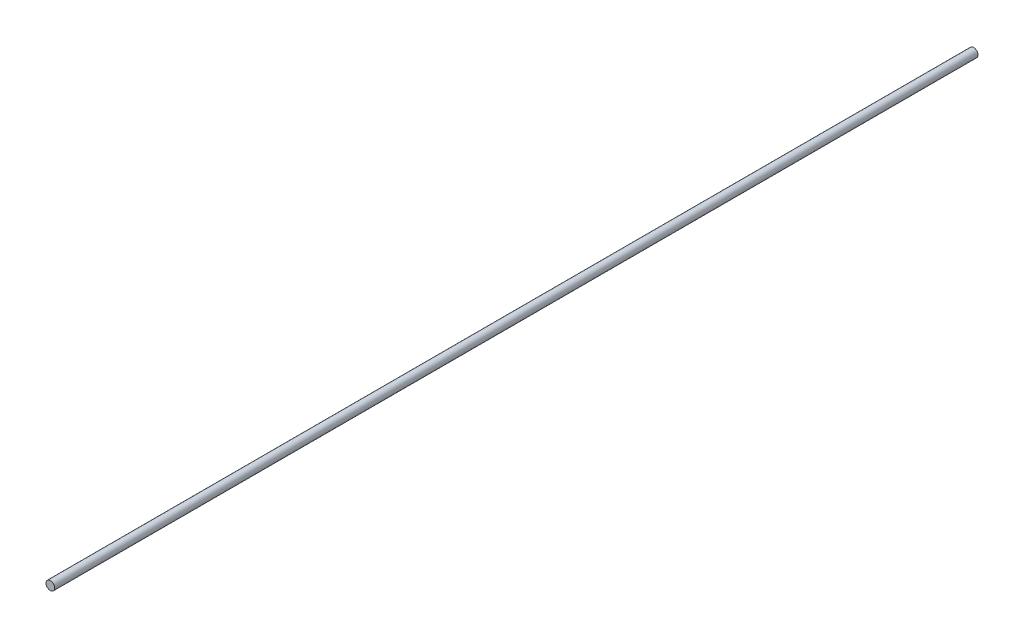
ISO-10303-21;
HEADER;
FILE_DESCRIPTION(('STEP AP214'),'2;1');
FILE_NAME('part.step','',(''),(''),'','','');
FILE_SCHEMA(('AUTOMOTIVE_DESIGN { 1 0 10303 214 1 1 1 1 }'));
ENDSEC;
DATA;
#1=APPLICATION_CONTEXT('core data for automotive mechanical design processes');
#2=APPLICATION_PROTOCOL_DEFINITION('international standard','automotive_design',2000,#1);
#3=PRODUCT_CONTEXT('',#1,'mechanical');
#4=PRODUCT('Part','Part','',(#3));
#5=PRODUCT_RELATED_PRODUCT_CATEGORY('part','',(#4));
#6=PRODUCT_DEFINITION_FORMATION('','',#4);
#7=PRODUCT_DEFINITION_CONTEXT('part definition',#1,'design');
#8=PRODUCT_DEFINITION('design','',#6,#7);
#9=PRODUCT_DEFINITION_SHAPE('','',#8);
#10=(LENGTH_UNIT() NAMED_UNIT(*) SI_UNIT(.MILLI.,.METRE.));
#11=(NAMED_UNIT(*) PLANE_ANGLE_UNIT() SI_UNIT($,.RADIAN.));
#12=(NAMED_UNIT(*) SI_UNIT($,.STERADIAN.) SOLID_ANGLE_UNIT());
#13=UNCERTAINTY_MEASURE_WITH_UNIT(LENGTH_MEASURE(1.E-05),#10,'distance_accuracy_value','');
#14=(GEOMETRIC_REPRESENTATION_CONTEXT(3) GLOBAL_UNCERTAINTY_ASSIGNED_CONTEXT((#13)) GLOBAL_UNIT_ASSIGNED_CONTEXT((#10,
#11,#12)) REPRESENTATION_CONTEXT('',''));
#15=CARTESIAN_POINT('',(0.,0.,0.));
#16=DIRECTION('',(0.,0.,1.));
#17=DIRECTION('',(1.,0.,0.));
#18=AXIS2_PLACEMENT_3D('',#15,#16,#17);
#19=CARTESIAN_POINT('',(0.,0.,640.));
#20=DIRECTION('',(0.,0.,-1.));
#21=DIRECTION('',(-1.,0.,0.));
#22=AXIS2_PLACEMENT_3D('',#19,#20,#21);
#23=CYLINDRICAL_SURFACE('',#22,3.);
#24=CARTESIAN_POINT('',(0.,0.,640.));
#25=DIRECTION('',(0.,0.,1.));
#26=DIRECTION('',(1.,0.,0.));
#27=AXIS2_PLACEMENT_3D('',#24,#25,#26);
#28=CIRCLE('',#27,3.);
#29=CARTESIAN_POINT('',(3.,0.,640.));
#30=VERTEX_POINT('',#29);
#31=EDGE_CURVE('E10',#30,#30,#28,.T.);
#32=ORIENTED_EDGE('',*,*,#31,.F.);
#33=EDGE_LOOP('',(#32));
#34=FACE_BOUND('',#33,.T.);
#35=CARTESIAN_POINT('',(0.,0.,0.));
#36=DIRECTION('',(0.,0.,1.));
#37=DIRECTION('',(1.,0.,0.));
#38=AXIS2_PLACEMENT_3D('',#35,#36,#37);
#39=CIRCLE('',#38,3.);
#40=CARTESIAN_POINT('',(3.,0.,0.));
#41=VERTEX_POINT('',#40);
#42=EDGE_CURVE('E33',#41,#41,#39,.T.);
#43=ORIENTED_EDGE('',*,*,#42,.T.);
#44=EDGE_LOOP('',(#43));
#45=FACE_BOUND('',#44,.T.);
#46=ADVANCED_FACE('F30',(#34,#45),#23,.T.);
#47=CARTESIAN_POINT('',(0.,0.,640.));
#48=DIRECTION('',(0.,0.,1.));
#49=DIRECTION('',(1.,0.,0.));
#50=AXIS2_PLACEMENT_3D('',#47,#48,#49);
#51=PLANE('',#50);
#52=ORIENTED_EDGE('',*,*,#31,.T.);
#53=EDGE_LOOP('',(#52));
#54=FACE_BOUND('',#53,.T.);
#55=ADVANCED_FACE('F45',(#54),#51,.T.);
#56=CARTESIAN_POINT('',(0.,0.,0.));
#57=DIRECTION('',(0.,0.,1.));
#58=DIRECTION('',(1.,0.,0.));
#59=AXIS2_PLACEMENT_3D('',#56,#57,#58);
#60=PLANE('',#59);
#61=ORIENTED_EDGE('',*,*,#42,.F.);
#62=EDGE_LOOP('',(#61));
#63=FACE_BOUND('',#62,.T.);
#64=ADVANCED_FACE('F43',(#63),#60,.F.);
#65=CLOSED_SHELL('',(#46,#55,#64));
#66=MANIFOLD_SOLID_BREP('B2',#65);
#67=ADVANCED_BREP_SHAPE_REPRESENTATION('',(#18,#66),#14);
#68=SHAPE_DEFINITION_REPRESENTATION(#9,#67);
ENDSEC;
END-ISO-10303-21;
